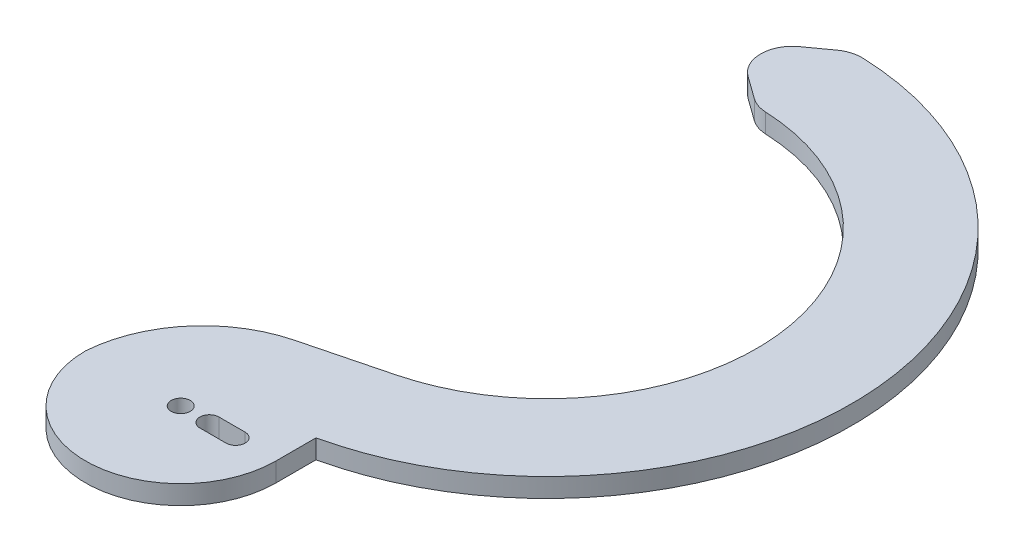
ISO-10303-21;
HEADER;
FILE_DESCRIPTION(('STEP AP214'),'2;1');
FILE_NAME('part.step','',(''),(''),'','','');
FILE_SCHEMA(('AUTOMOTIVE_DESIGN { 1 0 10303 214 1 1 1 1 }'));
ENDSEC;
DATA;
#1=APPLICATION_CONTEXT('core data for automotive mechanical design processes');
#2=APPLICATION_PROTOCOL_DEFINITION('international standard','automotive_design',2000,#1);
#3=PRODUCT_CONTEXT('',#1,'mechanical');
#4=PRODUCT('Part','Part','',(#3));
#5=PRODUCT_RELATED_PRODUCT_CATEGORY('part','',(#4));
#6=PRODUCT_DEFINITION_FORMATION('','',#4);
#7=PRODUCT_DEFINITION_CONTEXT('part definition',#1,'design');
#8=PRODUCT_DEFINITION('design','',#6,#7);
#9=PRODUCT_DEFINITION_SHAPE('','',#8);
#10=(LENGTH_UNIT() NAMED_UNIT(*) SI_UNIT(.MILLI.,.METRE.));
#11=(NAMED_UNIT(*) PLANE_ANGLE_UNIT() SI_UNIT($,.RADIAN.));
#12=(NAMED_UNIT(*) SI_UNIT($,.STERADIAN.) SOLID_ANGLE_UNIT());
#13=UNCERTAINTY_MEASURE_WITH_UNIT(LENGTH_MEASURE(1.E-05),#10,'distance_accuracy_value','');
#14=(GEOMETRIC_REPRESENTATION_CONTEXT(3) GLOBAL_UNCERTAINTY_ASSIGNED_CONTEXT((#13)) GLOBAL_UNIT_ASSIGNED_CONTEXT((#10,
#11,#12)) REPRESENTATION_CONTEXT('',''));
#15=CARTESIAN_POINT('',(0.,0.,0.));
#16=DIRECTION('',(0.,0.,1.));
#17=DIRECTION('',(1.,0.,0.));
#18=AXIS2_PLACEMENT_3D('',#15,#16,#17);
#19=CARTESIAN_POINT('',(10.4834420470046,3.,0.));
#20=DIRECTION('',(-1.,0.,0.));
#21=DIRECTION('',(0.,0.,1.));
#22=AXIS2_PLACEMENT_3D('',#19,#20,#21);
#23=PLANE('',#22);
#24=DIRECTION('',(0.,0.,-1.));
#25=VECTOR('',#24,1.);
#26=CARTESIAN_POINT('',(10.4834420470046,0.,0.));
#27=LINE('',#26,#25);
#28=CARTESIAN_POINT('',(10.4834420470046,0.,53.14));
#29=VERTEX_POINT('',#28);
#30=CARTESIAN_POINT('',(10.4834420470046,0.,46.8411938665861));
#31=VERTEX_POINT('',#30);
#32=EDGE_CURVE('E208',#29,#31,#27,.T.);
#33=ORIENTED_EDGE('',*,*,#32,.T.);
#34=DIRECTION('',(0.,-1.,0.));
#35=VECTOR('',#34,1.);
#36=CARTESIAN_POINT('',(10.4834420470046,3.,46.8411938665861));
#37=LINE('',#36,#35);
#38=CARTESIAN_POINT('',(10.4834420470046,3.,46.8411938665861));
#39=VERTEX_POINT('',#38);
#40=EDGE_CURVE('E241',#39,#31,#37,.T.);
#41=ORIENTED_EDGE('',*,*,#40,.F.);
#42=DIRECTION('',(0.,0.,-1.));
#43=VECTOR('',#42,1.);
#44=CARTESIAN_POINT('',(10.4834420470046,3.,0.));
#45=LINE('',#44,#43);
#46=CARTESIAN_POINT('',(10.4834420470046,3.,53.14));
#47=VERTEX_POINT('',#46);
#48=EDGE_CURVE('E372',#47,#39,#45,.T.);
#49=ORIENTED_EDGE('',*,*,#48,.F.);
#50=DIRECTION('',(0.,-1.,0.));
#51=VECTOR('',#50,1.);
#52=CARTESIAN_POINT('',(10.4834420470046,3.,53.14));
#53=LINE('',#52,#51);
#54=EDGE_CURVE('E233',#47,#29,#53,.T.);
#55=ORIENTED_EDGE('',*,*,#54,.T.);
#56=EDGE_LOOP('',(#33,#41,#49,#55));
#57=FACE_BOUND('',#56,.T.);
#58=ADVANCED_FACE('F45',(#57),#23,.F.);
#59=CARTESIAN_POINT('',(0.,3.,0.));
#60=DIRECTION('',(0.,-1.,0.));
#61=DIRECTION('',(0.,0.,-1.));
#62=AXIS2_PLACEMENT_3D('',#59,#60,#61);
#63=CYLINDRICAL_SURFACE('',#62,48.);
#64=CARTESIAN_POINT('',(0.,0.,0.));
#65=DIRECTION('',(0.,1.,0.));
#66=DIRECTION('',(0.,0.,1.));
#67=AXIS2_PLACEMENT_3D('',#64,#65,#66);
#68=CIRCLE('',#67,48.);
#69=CARTESIAN_POINT('',(1.75489275571207,0.,-47.9679096002312));
#70=VERTEX_POINT('',#69);
#71=EDGE_CURVE('E212',#31,#70,#68,.T.);
#72=ORIENTED_EDGE('',*,*,#71,.T.);
#73=DIRECTION('',(0.,-1.,0.));
#74=VECTOR('',#73,1.);
#75=CARTESIAN_POINT('',(1.75489275571207,3.,-47.9679096002312));
#76=LINE('',#75,#74);
#77=CARTESIAN_POINT('',(1.75489275571207,3.,-47.9679096002312));
#78=VERTEX_POINT('',#77);
#79=EDGE_CURVE('E279',#70,#78,#76,.F.);
#80=ORIENTED_EDGE('',*,*,#79,.T.);
#81=CARTESIAN_POINT('',(0.,3.,0.));
#82=DIRECTION('',(0.,1.,0.));
#83=DIRECTION('',(0.,0.,1.));
#84=AXIS2_PLACEMENT_3D('',#81,#82,#83);
#85=CIRCLE('',#84,48.);
#86=EDGE_CURVE('E371',#39,#78,#85,.T.);
#87=ORIENTED_EDGE('',*,*,#86,.F.);
#88=ORIENTED_EDGE('',*,*,#40,.T.);
#89=EDGE_LOOP('',(#72,#80,#87,#88));
#90=FACE_BOUND('',#89,.T.);
#91=ADVANCED_FACE('F311',(#90),#63,.T.);
#92=CARTESIAN_POINT('',(-22.7569674268065,3.,-31.6236758545514));
#93=DIRECTION('',(-0.584100521911124,0.,-0.811681329280866));
#94=DIRECTION('',(-0.811681329280866,0.,0.584100521911124));
#95=AXIS2_PLACEMENT_3D('',#92,#93,#94);
#96=PLANE('',#95);
#97=DIRECTION('',(0.811681329280866,0.,-0.584100521911124));
#98=VECTOR('',#97,1.);
#99=CARTESIAN_POINT('',(-22.7569674268065,3.,-31.6236758545514));
#100=LINE('',#99,#98);
#101=CARTESIAN_POINT('',(-4.78252794390728,3.,-44.5584066464043));
#102=VERTEX_POINT('',#101);
#103=CARTESIAN_POINT('',(-1.34841118256355,3.,-47.0296589966115));
#104=VERTEX_POINT('',#103);
#105=EDGE_CURVE('E185',#102,#104,#100,.T.);
#106=ORIENTED_EDGE('',*,*,#105,.T.);
#107=DIRECTION('',(0.,1.,0.));
#108=VECTOR('',#107,1.);
#109=CARTESIAN_POINT('',(-1.34841118256356,0.,-47.0296589966115));
#110=LINE('',#109,#108);
#111=CARTESIAN_POINT('',(-1.34841118256355,0.,-47.0296589966115));
#112=VERTEX_POINT('',#111);
#113=EDGE_CURVE('E269',#104,#112,#110,.F.);
#114=ORIENTED_EDGE('',*,*,#113,.T.);
#115=DIRECTION('',(0.811681329280866,0.,-0.584100521911124));
#116=VECTOR('',#115,1.);
#117=CARTESIAN_POINT('',(-22.7569674268065,0.,-31.6236758545514));
#118=LINE('',#117,#116);
#119=CARTESIAN_POINT('',(-4.78252794390728,0.,-44.5584066464043));
#120=VERTEX_POINT('',#119);
#121=EDGE_CURVE('E216',#120,#112,#118,.T.);
#122=ORIENTED_EDGE('',*,*,#121,.F.);
#123=DIRECTION('',(0.,-1.,0.));
#124=VECTOR('',#123,1.);
#125=CARTESIAN_POINT('',(-4.78252794390729,3.,-44.5584066464043));
#126=LINE('',#125,#124);
#127=EDGE_CURVE('E262',#120,#102,#126,.F.);
#128=ORIENTED_EDGE('',*,*,#127,.T.);
#129=EDGE_LOOP('',(#106,#114,#122,#128));
#130=FACE_BOUND('',#129,.T.);
#131=ADVANCED_FACE('F317',(#130),#96,.T.);
#132=CARTESIAN_POINT('',(15.6454151059294,3.,-21.741277150004));
#133=DIRECTION('',(-0.584100521911124,0.,0.811681329280866));
#134=DIRECTION('',(0.811681329280866,0.,0.584100521911124));
#135=AXIS2_PLACEMENT_3D('',#132,#133,#134);
#136=PLANE('',#135);
#137=DIRECTION('',(-0.811681329280866,0.,-0.584100521911124));
#138=VECTOR('',#137,1.);
#139=CARTESIAN_POINT('',(15.6454151059294,0.,-21.741277150004));
#140=LINE('',#139,#138);
#141=CARTESIAN_POINT('',(-1.25789516049757,0.,-33.9052040415997));
#142=VERTEX_POINT('',#141);
#143=CARTESIAN_POINT('',(-4.7825279439073,0.,-36.4415933535957));
#144=VERTEX_POINT('',#143);
#145=EDGE_CURVE('E220',#142,#144,#140,.T.);
#146=ORIENTED_EDGE('',*,*,#145,.F.);
#147=DIRECTION('',(0.,-1.,0.));
#148=VECTOR('',#147,1.);
#149=CARTESIAN_POINT('',(-1.25789516049755,3.,-33.9052040415997));
#150=LINE('',#149,#148);
#151=CARTESIAN_POINT('',(-1.25789516049757,3.,-33.9052040415997));
#152=VERTEX_POINT('',#151);
#153=EDGE_CURVE('E290',#142,#152,#150,.F.);
#154=ORIENTED_EDGE('',*,*,#153,.T.);
#155=DIRECTION('',(-0.811681329280866,0.,-0.584100521911124));
#156=VECTOR('',#155,1.);
#157=CARTESIAN_POINT('',(15.6454151059294,3.,-21.741277150004));
#158=LINE('',#157,#156);
#159=CARTESIAN_POINT('',(-4.7825279439073,3.,-36.4415933535957));
#160=VERTEX_POINT('',#159);
#161=EDGE_CURVE('E179',#152,#160,#158,.T.);
#162=ORIENTED_EDGE('',*,*,#161,.T.);
#163=DIRECTION('',(0.,-1.,0.));
#164=VECTOR('',#163,1.);
#165=CARTESIAN_POINT('',(-4.78252794390729,3.,-36.4415933535957));
#166=LINE('',#165,#164);
#167=EDGE_CURVE('E245',#160,#144,#166,.T.);
#168=ORIENTED_EDGE('',*,*,#167,.T.);
#169=EDGE_LOOP('',(#146,#154,#162,#168));
#170=FACE_BOUND('',#169,.T.);
#171=ADVANCED_FACE('F357',(#170),#136,.T.);
#172=CARTESIAN_POINT('',(0.,3.,0.));
#173=DIRECTION('',(0.,-1.,0.));
#174=DIRECTION('',(0.,0.,-1.));
#175=AXIS2_PLACEMENT_3D('',#172,#173,#174);
#176=CYLINDRICAL_SURFACE('',#175,32.9999999999999);
#177=DIRECTION('',(0.,-1.,0.));
#178=VECTOR('',#177,1.);
#179=CARTESIAN_POINT('',(1.4438433110241,3.,-32.9683987553719));
#180=LINE('',#179,#178);
#181=CARTESIAN_POINT('',(1.4438433110241,3.,-32.9683987553719));
#182=VERTEX_POINT('',#181);
#183=CARTESIAN_POINT('',(1.4438433110241,0.,-32.9683987553719));
#184=VERTEX_POINT('',#183);
#185=EDGE_CURVE('E287',#182,#184,#180,.T.);
#186=ORIENTED_EDGE('',*,*,#185,.T.);
#187=CARTESIAN_POINT('',(0.,0.,0.));
#188=DIRECTION('',(0.,1.,0.));
#189=DIRECTION('',(0.,0.,1.));
#190=AXIS2_PLACEMENT_3D('',#187,#188,#189);
#191=CIRCLE('',#190,32.9999999999999);
#192=CARTESIAN_POINT('',(8.19697315420249,0.,31.9657568123534));
#193=VERTEX_POINT('',#192);
#194=EDGE_CURVE('E167',#193,#184,#191,.T.);
#195=ORIENTED_EDGE('',*,*,#194,.F.);
#196=DIRECTION('',(0.,-1.,0.));
#197=VECTOR('',#196,1.);
#198=CARTESIAN_POINT('',(8.19697319658506,3.,31.9657569776328));
#199=LINE('',#198,#197);
#200=CARTESIAN_POINT('',(8.19697315420249,3.,31.9657568123534));
#201=VERTEX_POINT('',#200);
#202=EDGE_CURVE('E155',#201,#193,#199,.T.);
#203=ORIENTED_EDGE('',*,*,#202,.F.);
#204=CARTESIAN_POINT('',(0.,3.,0.));
#205=DIRECTION('',(0.,1.,0.));
#206=DIRECTION('',(0.,0.,1.));
#207=AXIS2_PLACEMENT_3D('',#204,#205,#206);
#208=CIRCLE('',#207,32.9999999999999);
#209=EDGE_CURVE('E165',#201,#182,#208,.T.);
#210=ORIENTED_EDGE('',*,*,#209,.T.);
#211=EDGE_LOOP('',(#186,#195,#203,#210));
#212=FACE_BOUND('',#211,.T.);
#213=ADVANCED_FACE('F164',(#212),#176,.F.);
#214=CARTESIAN_POINT('',(0.,3.,53.14));
#215=DIRECTION('',(0.,-1.,0.));
#216=DIRECTION('',(0.,0.,-1.));
#217=AXIS2_PLACEMENT_3D('',#214,#215,#216);
#218=CYLINDRICAL_SURFACE('',#217,1.5);
#219=CARTESIAN_POINT('',(0.,0.,53.14));
#220=DIRECTION('',(0.,1.,0.));
#221=DIRECTION('',(0.,0.,1.));
#222=AXIS2_PLACEMENT_3D('',#219,#220,#221);
#223=CIRCLE('',#222,1.5);
#224=CARTESIAN_POINT('',(0.,0.,51.64));
#225=VERTEX_POINT('',#224);
#226=CARTESIAN_POINT('',(0.,0.,54.6399999999997));
#227=VERTEX_POINT('',#226);
#228=EDGE_CURVE('E169',#225,#227,#223,.T.);
#229=ORIENTED_EDGE('',*,*,#228,.F.);
#230=DIRECTION('',(0.,-1.,0.));
#231=VECTOR('',#230,1.);
#232=CARTESIAN_POINT('',(0.,3.,51.64));
#233=LINE('',#232,#231);
#234=CARTESIAN_POINT('',(0.,3.,51.64));
#235=VERTEX_POINT('',#234);
#236=EDGE_CURVE('E238',#235,#225,#233,.T.);
#237=ORIENTED_EDGE('',*,*,#236,.F.);
#238=CARTESIAN_POINT('',(0.,3.,53.14));
#239=DIRECTION('',(0.,1.,0.));
#240=DIRECTION('',(0.,0.,1.));
#241=AXIS2_PLACEMENT_3D('',#238,#239,#240);
#242=CIRCLE('',#241,1.5);
#243=CARTESIAN_POINT('',(0.,3.,54.6399999999997));
#244=VERTEX_POINT('',#243);
#245=EDGE_CURVE('E232',#235,#244,#242,.T.);
#246=ORIENTED_EDGE('',*,*,#245,.T.);
#247=DIRECTION('',(0.,-1.,0.));
#248=VECTOR('',#247,1.);
#249=CARTESIAN_POINT('',(0.,3.,54.6399999999997));
#250=LINE('',#249,#248);
#251=EDGE_CURVE('E192',#244,#227,#250,.T.);
#252=ORIENTED_EDGE('',*,*,#251,.T.);
#253=EDGE_LOOP('',(#229,#237,#246,#252));
#254=FACE_BOUND('',#253,.T.);
#255=ADVANCED_FACE('F334',(#254),#218,.F.);
#256=CARTESIAN_POINT('',(-3.29885793821859E-12,3.,51.64));
#257=DIRECTION('',(0.,0.,-1.));
#258=DIRECTION('',(-1.,0.,0.));
#259=AXIS2_PLACEMENT_3D('',#256,#257,#258);
#260=PLANE('',#259);
#261=DIRECTION('',(1.,0.,0.));
#262=VECTOR('',#261,1.);
#263=CARTESIAN_POINT('',(-3.29885793821859E-12,0.,51.64));
#264=LINE('',#263,#262);
#265=CARTESIAN_POINT('',(4.12758916586391,0.,51.6400000000003));
#266=VERTEX_POINT('',#265);
#267=EDGE_CURVE('E196',#225,#266,#264,.T.);
#268=ORIENTED_EDGE('',*,*,#267,.T.);
#269=DIRECTION('',(0.,-1.,0.));
#270=VECTOR('',#269,1.);
#271=CARTESIAN_POINT('',(4.12758916586391,3.,51.6400000000003));
#272=LINE('',#271,#270);
#273=CARTESIAN_POINT('',(4.12758916586391,3.,51.6400000000003));
#274=VERTEX_POINT('',#273);
#275=EDGE_CURVE('E251',#274,#266,#272,.T.);
#276=ORIENTED_EDGE('',*,*,#275,.F.);
#277=DIRECTION('',(1.,0.,0.));
#278=VECTOR('',#277,1.);
#279=CARTESIAN_POINT('',(-3.29885793821859E-12,3.,51.64));
#280=LINE('',#279,#278);
#281=EDGE_CURVE('E387',#235,#274,#280,.T.);
#282=ORIENTED_EDGE('',*,*,#281,.F.);
#283=ORIENTED_EDGE('',*,*,#236,.T.);
#284=EDGE_LOOP('',(#268,#276,#282,#283));
#285=FACE_BOUND('',#284,.T.);
#286=ADVANCED_FACE('F330',(#285),#260,.F.);
#287=CARTESIAN_POINT('',(4.12758916586402,3.,53.14));
#288=DIRECTION('',(0.,-1.,0.));
#289=DIRECTION('',(0.,0.,-1.));
#290=AXIS2_PLACEMENT_3D('',#287,#288,#289);
#291=CYLINDRICAL_SURFACE('',#290,1.5);
#292=CARTESIAN_POINT('',(4.12758916586402,0.,53.14));
#293=DIRECTION('',(0.,1.,0.));
#294=DIRECTION('',(0.,0.,1.));
#295=AXIS2_PLACEMENT_3D('',#292,#293,#294);
#296=CIRCLE('',#295,1.5);
#297=CARTESIAN_POINT('',(4.12758916586394,0.,54.6400000000001));
#298=VERTEX_POINT('',#297);
#299=EDGE_CURVE('E200',#298,#266,#296,.T.);
#300=ORIENTED_EDGE('',*,*,#299,.F.);
#301=DIRECTION('',(0.,-1.,0.));
#302=VECTOR('',#301,1.);
#303=CARTESIAN_POINT('',(4.12758916586394,3.,54.6400000000001));
#304=LINE('',#303,#302);
#305=CARTESIAN_POINT('',(4.12758916586394,3.,54.6400000000001));
#306=VERTEX_POINT('',#305);
#307=EDGE_CURVE('E248',#306,#298,#304,.T.);
#308=ORIENTED_EDGE('',*,*,#307,.F.);
#309=CARTESIAN_POINT('',(4.12758916586402,3.,53.14));
#310=DIRECTION('',(0.,1.,0.));
#311=DIRECTION('',(0.,0.,1.));
#312=AXIS2_PLACEMENT_3D('',#309,#310,#311);
#313=CIRCLE('',#312,1.5);
#314=EDGE_CURVE('E380',#306,#274,#313,.T.);
#315=ORIENTED_EDGE('',*,*,#314,.T.);
#316=ORIENTED_EDGE('',*,*,#275,.T.);
#317=EDGE_LOOP('',(#300,#308,#315,#316));
#318=FACE_BOUND('',#317,.T.);
#319=ADVANCED_FACE('F327',(#318),#291,.F.);
#320=CARTESIAN_POINT('',(-4.5165579529954,3.,53.14));
#321=DIRECTION('',(0.,-1.,0.));
#322=DIRECTION('',(0.,0.,-1.));
#323=AXIS2_PLACEMENT_3D('',#320,#321,#322);
#324=CYLINDRICAL_SURFACE('',#323,15.);
#325=CARTESIAN_POINT('',(-4.5165579529954,0.,53.14));
#326=DIRECTION('',(0.,1.,0.));
#327=DIRECTION('',(0.,0.,1.));
#328=AXIS2_PLACEMENT_3D('',#325,#326,#327);
#329=CIRCLE('',#328,15.);
#330=CARTESIAN_POINT('',(-19.5165579529954,0.,53.14));
#331=VERTEX_POINT('',#330);
#332=EDGE_CURVE('E225',#331,#29,#329,.T.);
#333=ORIENTED_EDGE('',*,*,#332,.T.);
#334=ORIENTED_EDGE('',*,*,#54,.F.);
#335=CARTESIAN_POINT('',(-4.5165579529954,3.,53.14));
#336=DIRECTION('',(0.,1.,0.));
#337=DIRECTION('',(0.,0.,1.));
#338=AXIS2_PLACEMENT_3D('',#335,#336,#337);
#339=CIRCLE('',#338,15.);
#340=CARTESIAN_POINT('',(-19.5165579529954,3.,53.14));
#341=VERTEX_POINT('',#340);
#342=EDGE_CURVE('E178',#341,#47,#339,.T.);
#343=ORIENTED_EDGE('',*,*,#342,.F.);
#344=DIRECTION('',(0.,-1.,0.));
#345=VECTOR('',#344,1.);
#346=CARTESIAN_POINT('',(-19.5165579529954,3.,53.14));
#347=LINE('',#346,#345);
#348=EDGE_CURVE('E237',#341,#331,#347,.T.);
#349=ORIENTED_EDGE('',*,*,#348,.T.);
#350=EDGE_LOOP('',(#333,#334,#343,#349));
#351=FACE_BOUND('',#350,.T.);
#352=ADVANCED_FACE('F302',(#351),#324,.T.);
#353=CARTESIAN_POINT('',(-4.59276768682636E-12,3.,54.6399999999997));
#354=DIRECTION('',(0.,0.,-1.));
#355=DIRECTION('',(-1.,0.,0.));
#356=AXIS2_PLACEMENT_3D('',#353,#354,#355);
#357=PLANE('',#356);
#358=DIRECTION('',(1.,0.,0.));
#359=VECTOR('',#358,1.);
#360=CARTESIAN_POINT('',(-4.59276768682636E-12,0.,54.6399999999997));
#361=LINE('',#360,#359);
#362=EDGE_CURVE('E204',#227,#298,#361,.T.);
#363=ORIENTED_EDGE('',*,*,#362,.F.);
#364=ORIENTED_EDGE('',*,*,#251,.F.);
#365=DIRECTION('',(1.,0.,0.));
#366=VECTOR('',#365,1.);
#367=CARTESIAN_POINT('',(-4.59276768682636E-12,3.,54.6399999999997));
#368=LINE('',#367,#366);
#369=EDGE_CURVE('E374',#244,#306,#368,.T.);
#370=ORIENTED_EDGE('',*,*,#369,.T.);
#371=ORIENTED_EDGE('',*,*,#307,.T.);
#372=EDGE_LOOP('',(#363,#364,#370,#371));
#373=FACE_BOUND('',#372,.T.);
#374=ADVANCED_FACE('F322',(#373),#357,.T.);
#375=CARTESIAN_POINT('',(-4.5165579529954,3.,53.14));
#376=DIRECTION('',(0.,-1.,0.));
#377=DIRECTION('',(0.,0.,-1.));
#378=AXIS2_PLACEMENT_3D('',#375,#376,#377);
#379=CYLINDRICAL_SURFACE('',#378,1.5);
#380=CARTESIAN_POINT('',(-4.5165579529954,3.,53.14));
#381=DIRECTION('',(0.,1.,0.));
#382=DIRECTION('',(0.,0.,1.));
#383=AXIS2_PLACEMENT_3D('',#380,#381,#382);
#384=CIRCLE('',#383,1.5);
#385=CARTESIAN_POINT('',(-4.5165579529954,3.,54.64));
#386=VERTEX_POINT('',#385);
#387=EDGE_CURVE('E183',#386,#386,#384,.T.);
#388=ORIENTED_EDGE('',*,*,#387,.T.);
#389=EDGE_LOOP('',(#388));
#390=FACE_BOUND('',#389,.T.);
#391=CARTESIAN_POINT('',(-4.5165579529954,0.,53.14));
#392=DIRECTION('',(0.,1.,0.));
#393=DIRECTION('',(0.,0.,1.));
#394=AXIS2_PLACEMENT_3D('',#391,#392,#393);
#395=CIRCLE('',#394,1.5);
#396=CARTESIAN_POINT('',(-4.5165579529954,0.,54.64));
#397=VERTEX_POINT('',#396);
#398=EDGE_CURVE('E228',#397,#397,#395,.T.);
#399=ORIENTED_EDGE('',*,*,#398,.F.);
#400=EDGE_LOOP('',(#399));
#401=FACE_BOUND('',#400,.T.);
#402=ADVANCED_FACE('F325',(#390,#401),#379,.F.);
#403=CARTESIAN_POINT('',(0.,3.,0.));
#404=DIRECTION('',(0.,1.,0.));
#405=DIRECTION('',(0.,0.,1.));
#406=AXIS2_PLACEMENT_3D('',#403,#404,#405);
#407=PLANE('',#406);
#408=DIRECTION('',(0.968659307360978,0.,-0.248393128453565));
#409=VECTOR('',#408,1.);
#410=CARTESIAN_POINT('',(8.20157023213472,3.,31.9645779845027));
#411=LINE('',#410,#409);
#412=CARTESIAN_POINT('',(-4.53811896064697,3.,35.2314141466848));
#413=VERTEX_POINT('',#412);
#414=EDGE_CURVE('E152',#413,#201,#411,.T.);
#415=ORIENTED_EDGE('',*,*,#414,.F.);
#416=CARTESIAN_POINT('',(0.429743608424332,3.,54.6046002939044));
#417=DIRECTION('',(0.,1.,0.));
#418=DIRECTION('',(0.,0.,1.));
#419=AXIS2_PLACEMENT_3D('',#416,#417,#418);
#420=CIRCLE('',#419,20.);
#421=EDGE_CURVE('E54',#413,#341,#420,.T.);
#422=ORIENTED_EDGE('',*,*,#421,.T.);
#423=ORIENTED_EDGE('',*,*,#342,.T.);
#424=ORIENTED_EDGE('',*,*,#48,.T.);
#425=ORIENTED_EDGE('',*,*,#86,.T.);
#426=CARTESIAN_POINT('',(1.57209142699206,3.,-42.9712523502071));
#427=DIRECTION('',(0.,1.,0.));
#428=DIRECTION('',(0.,0.,1.));
#429=AXIS2_PLACEMENT_3D('',#426,#427,#428);
#430=CIRCLE('',#429,5.);
#431=EDGE_CURVE('E284',#78,#104,#430,.T.);
#432=ORIENTED_EDGE('',*,*,#431,.T.);
#433=ORIENTED_EDGE('',*,*,#105,.F.);
#434=CARTESIAN_POINT('',(-1.86202533435167,3.,-40.5));
#435=DIRECTION('',(0.,1.,0.));
#436=DIRECTION('',(0.,0.,1.));
#437=AXIS2_PLACEMENT_3D('',#434,#435,#436);
#438=CIRCLE('',#437,5.);
#439=EDGE_CURVE('E265',#102,#160,#438,.T.);
#440=ORIENTED_EDGE('',*,*,#439,.T.);
#441=ORIENTED_EDGE('',*,*,#161,.F.);
#442=CARTESIAN_POINT('',(1.66260744905806,3.,-37.963610688004));
#443=DIRECTION('',(0.,1.,0.));
#444=DIRECTION('',(0.,0.,1.));
#445=AXIS2_PLACEMENT_3D('',#442,#443,#444);
#446=CIRCLE('',#445,5.);
#447=EDGE_CURVE('E175',#152,#182,#446,.T.);
#448=ORIENTED_EDGE('',*,*,#447,.T.);
#449=ORIENTED_EDGE('',*,*,#209,.F.);
#450=EDGE_LOOP('',(#415,#422,#423,#424,#425,#432,#433,#440,#441,#448,#449));
#451=FACE_BOUND('',#450,.T.);
#452=ORIENTED_EDGE('',*,*,#245,.F.);
#453=ORIENTED_EDGE('',*,*,#281,.T.);
#454=ORIENTED_EDGE('',*,*,#314,.F.);
#455=ORIENTED_EDGE('',*,*,#369,.F.);
#456=EDGE_LOOP('',(#452,#453,#454,#455));
#457=FACE_BOUND('',#456,.T.);
#458=ORIENTED_EDGE('',*,*,#387,.F.);
#459=EDGE_LOOP('',(#458));
#460=FACE_BOUND('',#459,.T.);
#461=ADVANCED_FACE('F171',(#451,#457,#460),#407,.T.);
#462=CARTESIAN_POINT('',(0.,0.,0.));
#463=DIRECTION('',(0.,1.,0.));
#464=DIRECTION('',(0.,0.,1.));
#465=AXIS2_PLACEMENT_3D('',#462,#463,#464);
#466=PLANE('',#465);
#467=ORIENTED_EDGE('',*,*,#228,.T.);
#468=ORIENTED_EDGE('',*,*,#362,.T.);
#469=ORIENTED_EDGE('',*,*,#299,.T.);
#470=ORIENTED_EDGE('',*,*,#267,.F.);
#471=EDGE_LOOP('',(#467,#468,#469,#470));
#472=FACE_BOUND('',#471,.T.);
#473=ORIENTED_EDGE('',*,*,#332,.F.);
#474=CARTESIAN_POINT('',(0.429743608424332,0.,54.6046002939044));
#475=DIRECTION('',(0.,1.,0.));
#476=DIRECTION('',(0.,0.,1.));
#477=AXIS2_PLACEMENT_3D('',#474,#475,#476);
#478=CIRCLE('',#477,20.);
#479=CARTESIAN_POINT('',(-4.53811896064697,0.,35.2314141466848));
#480=VERTEX_POINT('',#479);
#481=EDGE_CURVE('E11',#331,#480,#478,.F.);
#482=ORIENTED_EDGE('',*,*,#481,.T.);
#483=DIRECTION('',(0.968659307360978,0.,-0.248393128453565));
#484=VECTOR('',#483,1.);
#485=CARTESIAN_POINT('',(8.19697315420249,0.,31.9657568123534));
#486=LINE('',#485,#484);
#487=EDGE_CURVE('E293',#480,#193,#486,.T.);
#488=ORIENTED_EDGE('',*,*,#487,.T.);
#489=ORIENTED_EDGE('',*,*,#194,.T.);
#490=CARTESIAN_POINT('',(1.66260744905806,0.,-37.963610688004));
#491=DIRECTION('',(0.,1.,0.));
#492=DIRECTION('',(0.,0.,1.));
#493=AXIS2_PLACEMENT_3D('',#490,#491,#492);
#494=CIRCLE('',#493,5.);
#495=EDGE_CURVE('E273',#184,#142,#494,.F.);
#496=ORIENTED_EDGE('',*,*,#495,.T.);
#497=ORIENTED_EDGE('',*,*,#145,.T.);
#498=CARTESIAN_POINT('',(-1.86202533435167,0.,-40.5));
#499=DIRECTION('',(0.,1.,0.));
#500=DIRECTION('',(0.,0.,1.));
#501=AXIS2_PLACEMENT_3D('',#498,#499,#500);
#502=CIRCLE('',#501,5.);
#503=EDGE_CURVE('E259',#144,#120,#502,.F.);
#504=ORIENTED_EDGE('',*,*,#503,.T.);
#505=ORIENTED_EDGE('',*,*,#121,.T.);
#506=CARTESIAN_POINT('',(1.57209142699206,0.,-42.9712523502071));
#507=DIRECTION('',(0.,1.,0.));
#508=DIRECTION('',(0.,0.,1.));
#509=AXIS2_PLACEMENT_3D('',#506,#507,#508);
#510=CIRCLE('',#509,5.);
#511=EDGE_CURVE('E276',#112,#70,#510,.F.);
#512=ORIENTED_EDGE('',*,*,#511,.T.);
#513=ORIENTED_EDGE('',*,*,#71,.F.);
#514=ORIENTED_EDGE('',*,*,#32,.F.);
#515=EDGE_LOOP('',(#473,#482,#488,#489,#496,#497,#504,#505,#512,#513,#514));
#516=FACE_BOUND('',#515,.T.);
#517=ORIENTED_EDGE('',*,*,#398,.T.);
#518=EDGE_LOOP('',(#517));
#519=FACE_BOUND('',#518,.T.);
#520=ADVANCED_FACE('F343',(#472,#516,#519),#466,.F.);
#521=CARTESIAN_POINT('',(-1.86202533435167,3.,-40.5));
#522=DIRECTION('',(0.,-1.,0.));
#523=DIRECTION('',(0.,0.,-1.));
#524=AXIS2_PLACEMENT_3D('',#521,#522,#523);
#525=CYLINDRICAL_SURFACE('',#524,5.);
#526=ORIENTED_EDGE('',*,*,#439,.F.);
#527=ORIENTED_EDGE('',*,*,#127,.F.);
#528=ORIENTED_EDGE('',*,*,#503,.F.);
#529=ORIENTED_EDGE('',*,*,#167,.F.);
#530=EDGE_LOOP('',(#526,#527,#528,#529));
#531=FACE_BOUND('',#530,.T.);
#532=ADVANCED_FACE('F339',(#531),#525,.T.);
#533=CARTESIAN_POINT('',(1.57209142699206,3.,-42.9712523502071));
#534=DIRECTION('',(0.,-1.,0.));
#535=DIRECTION('',(0.,0.,-1.));
#536=AXIS2_PLACEMENT_3D('',#533,#534,#535);
#537=CYLINDRICAL_SURFACE('',#536,5.);
#538=ORIENTED_EDGE('',*,*,#431,.F.);
#539=ORIENTED_EDGE('',*,*,#79,.F.);
#540=ORIENTED_EDGE('',*,*,#511,.F.);
#541=ORIENTED_EDGE('',*,*,#113,.F.);
#542=EDGE_LOOP('',(#538,#539,#540,#541));
#543=FACE_BOUND('',#542,.T.);
#544=ADVANCED_FACE('F342',(#543),#537,.T.);
#545=CARTESIAN_POINT('',(1.66260744905806,3.,-37.963610688004));
#546=DIRECTION('',(0.,-1.,0.));
#547=DIRECTION('',(0.,0.,-1.));
#548=AXIS2_PLACEMENT_3D('',#545,#546,#547);
#549=CYLINDRICAL_SURFACE('',#548,5.);
#550=ORIENTED_EDGE('',*,*,#447,.F.);
#551=ORIENTED_EDGE('',*,*,#153,.F.);
#552=ORIENTED_EDGE('',*,*,#495,.F.);
#553=ORIENTED_EDGE('',*,*,#185,.F.);
#554=EDGE_LOOP('',(#550,#551,#552,#553));
#555=FACE_BOUND('',#554,.T.);
#556=ADVANCED_FACE('F308',(#555),#549,.T.);
#557=CARTESIAN_POINT('',(8.20157023213472,-7.,31.9645779845027));
#558=DIRECTION('',(0.248393128453565,0.,0.968659307360978));
#559=DIRECTION('',(0.968659307360978,0.,-0.248393128453565));
#560=AXIS2_PLACEMENT_3D('',#557,#558,#559);
#561=PLANE('',#560);
#562=ORIENTED_EDGE('',*,*,#487,.F.);
#563=DIRECTION('',(0.,-1.,0.));
#564=VECTOR('',#563,1.);
#565=CARTESIAN_POINT('',(-4.53811896064697,-7.,35.2314141466848));
#566=LINE('',#565,#564);
#567=EDGE_CURVE('E157',#480,#413,#566,.F.);
#568=ORIENTED_EDGE('',*,*,#567,.T.);
#569=ORIENTED_EDGE('',*,*,#414,.T.);
#570=ORIENTED_EDGE('',*,*,#202,.T.);
#571=EDGE_LOOP('',(#562,#568,#569,#570));
#572=FACE_BOUND('',#571,.T.);
#573=ADVANCED_FACE('F154',(#572),#561,.F.);
#574=CARTESIAN_POINT('',(0.429743608424332,3.,54.6046002939044));
#575=DIRECTION('',(0.,-1.,0.));
#576=DIRECTION('',(0.,0.,-1.));
#577=AXIS2_PLACEMENT_3D('',#574,#575,#576);
#578=CYLINDRICAL_SURFACE('',#577,20.);
#579=ORIENTED_EDGE('',*,*,#481,.F.);
#580=ORIENTED_EDGE('',*,*,#348,.F.);
#581=ORIENTED_EDGE('',*,*,#421,.F.);
#582=ORIENTED_EDGE('',*,*,#567,.F.);
#583=EDGE_LOOP('',(#579,#580,#581,#582));
#584=FACE_BOUND('',#583,.T.);
#585=ADVANCED_FACE('F47',(#584),#578,.T.);
#586=CLOSED_SHELL('',(#58,#91,#131,#171,#213,#255,#286,#319,#352,#374,#402,#461,#520,#532,#544,
#556,#573,#585));
#587=MANIFOLD_SOLID_BREP('B2',#586);
#588=ADVANCED_BREP_SHAPE_REPRESENTATION('',(#18,#587),#14);
#589=SHAPE_DEFINITION_REPRESENTATION(#9,#588);
ENDSEC;
END-ISO-10303-21;
